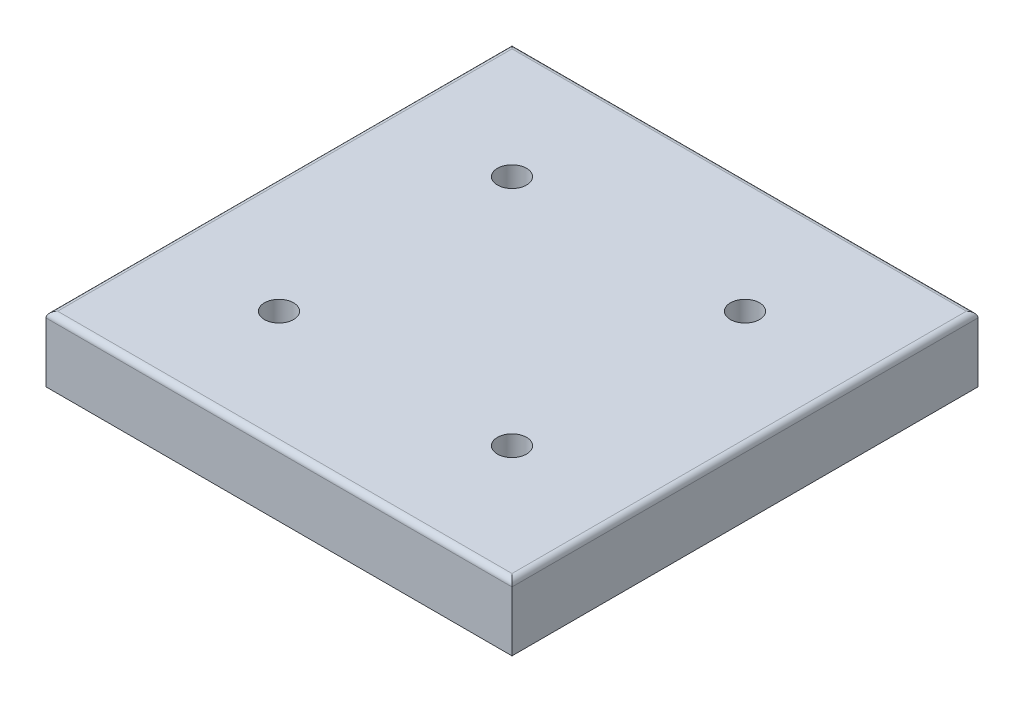
ISO-10303-21;
HEADER;
FILE_DESCRIPTION(('STEP AP214'),'2;1');
FILE_NAME('part.step','',(''),(''),'','','');
FILE_SCHEMA(('AUTOMOTIVE_DESIGN { 1 0 10303 214 1 1 1 1 }'));
ENDSEC;
DATA;
#1=APPLICATION_CONTEXT('core data for automotive mechanical design processes');
#2=APPLICATION_PROTOCOL_DEFINITION('international standard','automotive_design',2000,#1);
#3=PRODUCT_CONTEXT('',#1,'mechanical');
#4=PRODUCT('Part','Part','',(#3));
#5=PRODUCT_RELATED_PRODUCT_CATEGORY('part','',(#4));
#6=PRODUCT_DEFINITION_FORMATION('','',#4);
#7=PRODUCT_DEFINITION_CONTEXT('part definition',#1,'design');
#8=PRODUCT_DEFINITION('design','',#6,#7);
#9=PRODUCT_DEFINITION_SHAPE('','',#8);
#10=(LENGTH_UNIT() NAMED_UNIT(*) SI_UNIT(.MILLI.,.METRE.));
#11=(NAMED_UNIT(*) PLANE_ANGLE_UNIT() SI_UNIT($,.RADIAN.));
#12=(NAMED_UNIT(*) SI_UNIT($,.STERADIAN.) SOLID_ANGLE_UNIT());
#13=UNCERTAINTY_MEASURE_WITH_UNIT(LENGTH_MEASURE(1.E-05),#10,'distance_accuracy_value','');
#14=(GEOMETRIC_REPRESENTATION_CONTEXT(3) GLOBAL_UNCERTAINTY_ASSIGNED_CONTEXT((#13)) GLOBAL_UNIT_ASSIGNED_CONTEXT((#10,
#11,#12)) REPRESENTATION_CONTEXT('',''));
#15=CARTESIAN_POINT('',(0.,0.,0.));
#16=DIRECTION('',(0.,0.,1.));
#17=DIRECTION('',(1.,0.,0.));
#18=AXIS2_PLACEMENT_3D('',#15,#16,#17);
#19=CARTESIAN_POINT('',(0.,22.5,0.));
#20=DIRECTION('',(1.,0.,0.));
#21=DIRECTION('',(0.,0.,-1.));
#22=AXIS2_PLACEMENT_3D('',#19,#20,#21);
#23=PLANE('',#22);
#24=DIRECTION('',(0.,-1.,0.));
#25=VECTOR('',#24,1.);
#26=CARTESIAN_POINT('',(0.,22.5,0.));
#27=LINE('',#26,#25);
#28=CARTESIAN_POINT('',(0.,20.5,0.));
#29=VERTEX_POINT('',#28);
#30=CARTESIAN_POINT('',(0.,0.,0.));
#31=VERTEX_POINT('',#30);
#32=EDGE_CURVE('E87',#29,#31,#27,.T.);
#33=ORIENTED_EDGE('',*,*,#32,.F.);
#34=DIRECTION('',(0.,0.,1.));
#35=VECTOR('',#34,1.);
#36=CARTESIAN_POINT('',(0.,20.5,0.));
#37=LINE('',#36,#35);
#38=CARTESIAN_POINT('',(0.,20.5,-160.));
#39=VERTEX_POINT('',#38);
#40=EDGE_CURVE('E146',#29,#39,#37,.F.);
#41=ORIENTED_EDGE('',*,*,#40,.T.);
#42=DIRECTION('',(0.,-1.,0.));
#43=VECTOR('',#42,1.);
#44=CARTESIAN_POINT('',(0.,22.5,-160.));
#45=LINE('',#44,#43);
#46=CARTESIAN_POINT('',(0.,0.,-160.));
#47=VERTEX_POINT('',#46);
#48=EDGE_CURVE('E110',#39,#47,#45,.T.);
#49=ORIENTED_EDGE('',*,*,#48,.T.);
#50=DIRECTION('',(0.,0.,1.));
#51=VECTOR('',#50,1.);
#52=CARTESIAN_POINT('',(0.,0.,0.));
#53=LINE('',#52,#51);
#54=EDGE_CURVE('E106',#47,#31,#53,.T.);
#55=ORIENTED_EDGE('',*,*,#54,.T.);
#56=EDGE_LOOP('',(#33,#41,#49,#55));
#57=FACE_BOUND('',#56,.T.);
#58=ADVANCED_FACE('F34',(#57),#23,.F.);
#59=CARTESIAN_POINT('',(0.,22.5,0.));
#60=DIRECTION('',(0.,0.,-1.));
#61=DIRECTION('',(-1.,0.,0.));
#62=AXIS2_PLACEMENT_3D('',#59,#60,#61);
#63=PLANE('',#62);
#64=DIRECTION('',(0.,-1.,0.));
#65=VECTOR('',#64,1.);
#66=CARTESIAN_POINT('',(160.,22.5,0.));
#67=LINE('',#66,#65);
#68=CARTESIAN_POINT('',(160.,20.5,0.));
#69=VERTEX_POINT('',#68);
#70=CARTESIAN_POINT('',(160.,0.,0.));
#71=VERTEX_POINT('',#70);
#72=EDGE_CURVE('E99',#69,#71,#67,.T.);
#73=ORIENTED_EDGE('',*,*,#72,.F.);
#74=DIRECTION('',(1.,0.,0.));
#75=VECTOR('',#74,1.);
#76=CARTESIAN_POINT('',(0.,20.5,0.));
#77=LINE('',#76,#75);
#78=EDGE_CURVE('E93',#69,#29,#77,.F.);
#79=ORIENTED_EDGE('',*,*,#78,.T.);
#80=ORIENTED_EDGE('',*,*,#32,.T.);
#81=DIRECTION('',(1.,0.,0.));
#82=VECTOR('',#81,1.);
#83=CARTESIAN_POINT('',(0.,0.,0.));
#84=LINE('',#83,#82);
#85=EDGE_CURVE('E90',#31,#71,#84,.T.);
#86=ORIENTED_EDGE('',*,*,#85,.T.);
#87=EDGE_LOOP('',(#73,#79,#80,#86));
#88=FACE_BOUND('',#87,.T.);
#89=ADVANCED_FACE('F89',(#88),#63,.F.);
#90=CARTESIAN_POINT('',(160.,22.5,0.));
#91=DIRECTION('',(-1.,0.,0.));
#92=DIRECTION('',(0.,0.,1.));
#93=AXIS2_PLACEMENT_3D('',#90,#91,#92);
#94=PLANE('',#93);
#95=DIRECTION('',(0.,-1.,0.));
#96=VECTOR('',#95,1.);
#97=CARTESIAN_POINT('',(160.,22.5,-160.));
#98=LINE('',#97,#96);
#99=CARTESIAN_POINT('',(160.,20.5,-160.));
#100=VERTEX_POINT('',#99);
#101=CARTESIAN_POINT('',(160.,0.,-160.));
#102=VERTEX_POINT('',#101);
#103=EDGE_CURVE('E123',#100,#102,#98,.T.);
#104=ORIENTED_EDGE('',*,*,#103,.F.);
#105=DIRECTION('',(0.,0.,-1.));
#106=VECTOR('',#105,1.);
#107=CARTESIAN_POINT('',(160.,20.5,0.));
#108=LINE('',#107,#106);
#109=EDGE_CURVE('E43',#100,#69,#108,.F.);
#110=ORIENTED_EDGE('',*,*,#109,.T.);
#111=ORIENTED_EDGE('',*,*,#72,.T.);
#112=DIRECTION('',(0.,0.,-1.));
#113=VECTOR('',#112,1.);
#114=CARTESIAN_POINT('',(160.,0.,0.));
#115=LINE('',#114,#113);
#116=EDGE_CURVE('E108',#71,#102,#115,.T.);
#117=ORIENTED_EDGE('',*,*,#116,.T.);
#118=EDGE_LOOP('',(#104,#110,#111,#117));
#119=FACE_BOUND('',#118,.T.);
#120=ADVANCED_FACE('F208',(#119),#94,.F.);
#121=CARTESIAN_POINT('',(0.,22.5,-160.));
#122=DIRECTION('',(0.,0.,1.));
#123=DIRECTION('',(1.,0.,0.));
#124=AXIS2_PLACEMENT_3D('',#121,#122,#123);
#125=PLANE('',#124);
#126=ORIENTED_EDGE('',*,*,#48,.F.);
#127=DIRECTION('',(-1.,0.,0.));
#128=VECTOR('',#127,1.);
#129=CARTESIAN_POINT('',(0.,20.5,-160.));
#130=LINE('',#129,#128);
#131=EDGE_CURVE('E11',#39,#100,#130,.F.);
#132=ORIENTED_EDGE('',*,*,#131,.T.);
#133=ORIENTED_EDGE('',*,*,#103,.T.);
#134=DIRECTION('',(-1.,0.,0.));
#135=VECTOR('',#134,1.);
#136=CARTESIAN_POINT('',(0.,0.,-160.));
#137=LINE('',#136,#135);
#138=EDGE_CURVE('E120',#102,#47,#137,.T.);
#139=ORIENTED_EDGE('',*,*,#138,.T.);
#140=EDGE_LOOP('',(#126,#132,#133,#139));
#141=FACE_BOUND('',#140,.T.);
#142=ADVANCED_FACE('F180',(#141),#125,.F.);
#143=CARTESIAN_POINT('',(0.,22.5,0.));
#144=DIRECTION('',(0.,-1.,0.));
#145=DIRECTION('',(0.,0.,-1.));
#146=AXIS2_PLACEMENT_3D('',#143,#144,#145);
#147=PLANE('',#146);
#148=DIRECTION('',(-1.,0.,0.));
#149=VECTOR('',#148,1.);
#150=CARTESIAN_POINT('',(0.,22.5,-158.));
#151=LINE('',#150,#149);
#152=CARTESIAN_POINT('',(158.,22.5,-158.));
#153=VERTEX_POINT('',#152);
#154=CARTESIAN_POINT('',(2.,22.5,-158.));
#155=VERTEX_POINT('',#154);
#156=EDGE_CURVE('E137',#153,#155,#151,.T.);
#157=ORIENTED_EDGE('',*,*,#156,.T.);
#158=DIRECTION('',(0.,0.,1.));
#159=VECTOR('',#158,1.);
#160=CARTESIAN_POINT('',(2.,22.5,0.));
#161=LINE('',#160,#159);
#162=CARTESIAN_POINT('',(2.,22.5,-2.));
#163=VERTEX_POINT('',#162);
#164=EDGE_CURVE('E143',#155,#163,#161,.T.);
#165=ORIENTED_EDGE('',*,*,#164,.T.);
#166=DIRECTION('',(1.,0.,0.));
#167=VECTOR('',#166,1.);
#168=CARTESIAN_POINT('',(0.,22.5,-2.));
#169=LINE('',#168,#167);
#170=CARTESIAN_POINT('',(158.,22.5,-2.));
#171=VERTEX_POINT('',#170);
#172=EDGE_CURVE('E141',#163,#171,#169,.T.);
#173=ORIENTED_EDGE('',*,*,#172,.T.);
#174=DIRECTION('',(0.,0.,-1.));
#175=VECTOR('',#174,1.);
#176=CARTESIAN_POINT('',(158.,22.5,0.));
#177=LINE('',#176,#175);
#178=EDGE_CURVE('E139',#171,#153,#177,.T.);
#179=ORIENTED_EDGE('',*,*,#178,.T.);
#180=EDGE_LOOP('',(#157,#165,#173,#179));
#181=FACE_BOUND('',#180,.T.);
#182=CARTESIAN_POINT('',(120.,22.5,-120.));
#183=DIRECTION('',(0.,1.,0.));
#184=DIRECTION('',(0.,0.,1.));
#185=AXIS2_PLACEMENT_3D('',#182,#183,#184);
#186=CIRCLE('',#185,5.);
#187=CARTESIAN_POINT('',(120.,22.5,-115.));
#188=VERTEX_POINT('',#187);
#189=EDGE_CURVE('E164',#188,#188,#186,.T.);
#190=ORIENTED_EDGE('',*,*,#189,.F.);
#191=EDGE_LOOP('',(#190));
#192=FACE_BOUND('',#191,.T.);
#193=CARTESIAN_POINT('',(40.,22.5,-120.));
#194=DIRECTION('',(0.,1.,0.));
#195=DIRECTION('',(0.,0.,1.));
#196=AXIS2_PLACEMENT_3D('',#193,#194,#195);
#197=CIRCLE('',#196,5.);
#198=CARTESIAN_POINT('',(40.,22.5,-115.));
#199=VERTEX_POINT('',#198);
#200=EDGE_CURVE('E115',#199,#199,#197,.T.);
#201=ORIENTED_EDGE('',*,*,#200,.F.);
#202=EDGE_LOOP('',(#201));
#203=FACE_BOUND('',#202,.T.);
#204=CARTESIAN_POINT('',(40.,22.5,-40.));
#205=DIRECTION('',(0.,1.,0.));
#206=DIRECTION('',(0.,0.,1.));
#207=AXIS2_PLACEMENT_3D('',#204,#205,#206);
#208=CIRCLE('',#207,5.);
#209=CARTESIAN_POINT('',(40.,22.5,-35.));
#210=VERTEX_POINT('',#209);
#211=EDGE_CURVE('E128',#210,#210,#208,.T.);
#212=ORIENTED_EDGE('',*,*,#211,.F.);
#213=EDGE_LOOP('',(#212));
#214=FACE_BOUND('',#213,.T.);
#215=CARTESIAN_POINT('',(120.,22.5,-40.));
#216=DIRECTION('',(0.,1.,0.));
#217=DIRECTION('',(0.,0.,1.));
#218=AXIS2_PLACEMENT_3D('',#215,#216,#217);
#219=CIRCLE('',#218,5.);
#220=CARTESIAN_POINT('',(120.,22.5,-35.));
#221=VERTEX_POINT('',#220);
#222=EDGE_CURVE('E134',#221,#221,#219,.T.);
#223=ORIENTED_EDGE('',*,*,#222,.F.);
#224=EDGE_LOOP('',(#223));
#225=FACE_BOUND('',#224,.T.);
#226=ADVANCED_FACE('F177',(#181,#192,#203,#214,#225),#147,.F.);
#227=CARTESIAN_POINT('',(0.,0.,0.));
#228=DIRECTION('',(0.,-1.,0.));
#229=DIRECTION('',(0.,0.,-1.));
#230=AXIS2_PLACEMENT_3D('',#227,#228,#229);
#231=PLANE('',#230);
#232=CARTESIAN_POINT('',(120.,0.,-120.));
#233=DIRECTION('',(0.,1.,0.));
#234=DIRECTION('',(0.,0.,1.));
#235=AXIS2_PLACEMENT_3D('',#232,#233,#234);
#236=CIRCLE('',#235,5.);
#237=CARTESIAN_POINT('',(120.,0.,-115.));
#238=VERTEX_POINT('',#237);
#239=EDGE_CURVE('E159',#238,#238,#236,.T.);
#240=ORIENTED_EDGE('',*,*,#239,.T.);
#241=EDGE_LOOP('',(#240));
#242=FACE_BOUND('',#241,.T.);
#243=CARTESIAN_POINT('',(40.,0.,-120.));
#244=DIRECTION('',(0.,1.,0.));
#245=DIRECTION('',(0.,0.,1.));
#246=AXIS2_PLACEMENT_3D('',#243,#244,#245);
#247=CIRCLE('',#246,5.);
#248=CARTESIAN_POINT('',(40.,0.,-115.));
#249=VERTEX_POINT('',#248);
#250=EDGE_CURVE('E112',#249,#249,#247,.T.);
#251=ORIENTED_EDGE('',*,*,#250,.T.);
#252=EDGE_LOOP('',(#251));
#253=FACE_BOUND('',#252,.T.);
#254=ORIENTED_EDGE('',*,*,#54,.F.);
#255=ORIENTED_EDGE('',*,*,#138,.F.);
#256=ORIENTED_EDGE('',*,*,#116,.F.);
#257=ORIENTED_EDGE('',*,*,#85,.F.);
#258=EDGE_LOOP('',(#254,#255,#256,#257));
#259=FACE_BOUND('',#258,.T.);
#260=CARTESIAN_POINT('',(40.,0.,-40.));
#261=DIRECTION('',(0.,1.,0.));
#262=DIRECTION('',(0.,0.,1.));
#263=AXIS2_PLACEMENT_3D('',#260,#261,#262);
#264=CIRCLE('',#263,5.);
#265=CARTESIAN_POINT('',(40.,0.,-35.));
#266=VERTEX_POINT('',#265);
#267=EDGE_CURVE('E98',#266,#266,#264,.T.);
#268=ORIENTED_EDGE('',*,*,#267,.T.);
#269=EDGE_LOOP('',(#268));
#270=FACE_BOUND('',#269,.T.);
#271=CARTESIAN_POINT('',(120.,0.,-40.));
#272=DIRECTION('',(0.,1.,0.));
#273=DIRECTION('',(0.,0.,1.));
#274=AXIS2_PLACEMENT_3D('',#271,#272,#273);
#275=CIRCLE('',#274,5.);
#276=CARTESIAN_POINT('',(120.,0.,-35.));
#277=VERTEX_POINT('',#276);
#278=EDGE_CURVE('E131',#277,#277,#275,.T.);
#279=ORIENTED_EDGE('',*,*,#278,.T.);
#280=EDGE_LOOP('',(#279));
#281=FACE_BOUND('',#280,.T.);
#282=ADVANCED_FACE('F103',(#242,#253,#259,#270,#281),#231,.T.);
#283=CARTESIAN_POINT('',(40.,0.,-120.));
#284=DIRECTION('',(0.,1.,0.));
#285=DIRECTION('',(0.,0.,1.));
#286=AXIS2_PLACEMENT_3D('',#283,#284,#285);
#287=CYLINDRICAL_SURFACE('',#286,5.);
#288=ORIENTED_EDGE('',*,*,#250,.F.);
#289=EDGE_LOOP('',(#288));
#290=FACE_BOUND('',#289,.T.);
#291=ORIENTED_EDGE('',*,*,#200,.T.);
#292=EDGE_LOOP('',(#291));
#293=FACE_BOUND('',#292,.T.);
#294=ADVANCED_FACE('F175',(#290,#293),#287,.F.);
#295=CARTESIAN_POINT('',(120.,0.,-120.));
#296=DIRECTION('',(0.,1.,0.));
#297=DIRECTION('',(0.,0.,1.));
#298=AXIS2_PLACEMENT_3D('',#295,#296,#297);
#299=CYLINDRICAL_SURFACE('',#298,5.);
#300=ORIENTED_EDGE('',*,*,#239,.F.);
#301=EDGE_LOOP('',(#300));
#302=FACE_BOUND('',#301,.T.);
#303=ORIENTED_EDGE('',*,*,#189,.T.);
#304=EDGE_LOOP('',(#303));
#305=FACE_BOUND('',#304,.T.);
#306=ADVANCED_FACE('F198',(#302,#305),#299,.F.);
#307=CARTESIAN_POINT('',(40.,0.,-40.));
#308=DIRECTION('',(0.,1.,0.));
#309=DIRECTION('',(0.,0.,1.));
#310=AXIS2_PLACEMENT_3D('',#307,#308,#309);
#311=CYLINDRICAL_SURFACE('',#310,5.);
#312=ORIENTED_EDGE('',*,*,#267,.F.);
#313=EDGE_LOOP('',(#312));
#314=FACE_BOUND('',#313,.T.);
#315=ORIENTED_EDGE('',*,*,#211,.T.);
#316=EDGE_LOOP('',(#315));
#317=FACE_BOUND('',#316,.T.);
#318=ADVANCED_FACE('F189',(#314,#317),#311,.F.);
#319=CARTESIAN_POINT('',(120.,0.,-40.));
#320=DIRECTION('',(0.,1.,0.));
#321=DIRECTION('',(0.,0.,1.));
#322=AXIS2_PLACEMENT_3D('',#319,#320,#321);
#323=CYLINDRICAL_SURFACE('',#322,5.);
#324=ORIENTED_EDGE('',*,*,#278,.F.);
#325=EDGE_LOOP('',(#324));
#326=FACE_BOUND('',#325,.T.);
#327=ORIENTED_EDGE('',*,*,#222,.T.);
#328=EDGE_LOOP('',(#327));
#329=FACE_BOUND('',#328,.T.);
#330=ADVANCED_FACE('F187',(#326,#329),#323,.F.);
#331=CARTESIAN_POINT('',(158.,20.5,0.));
#332=DIRECTION('',(0.,0.,-1.));
#333=DIRECTION('',(-1.,0.,0.));
#334=AXIS2_PLACEMENT_3D('',#331,#332,#333);
#335=CYLINDRICAL_SURFACE('',#334,2.);
#336=CARTESIAN_POINT('',(158.,20.5,-2.));
#337=DIRECTION('',(0.707106781186547,0.,-0.707106781186547));
#338=DIRECTION('',(-0.707106781186547,0.,-0.707106781186547));
#339=AXIS2_PLACEMENT_3D('',#336,#337,#338);
#340=ELLIPSE('',#339,2.82842712474619,2.);
#341=EDGE_CURVE('E153',#69,#171,#340,.F.);
#342=ORIENTED_EDGE('',*,*,#341,.F.);
#343=ORIENTED_EDGE('',*,*,#109,.F.);
#344=CARTESIAN_POINT('',(158.,20.5,-158.));
#345=DIRECTION('',(-0.707106781186547,0.,-0.707106781186547));
#346=DIRECTION('',(-0.707106781186547,0.,0.707106781186547));
#347=AXIS2_PLACEMENT_3D('',#344,#345,#346);
#348=ELLIPSE('',#347,2.82842712474619,2.);
#349=EDGE_CURVE('E38',#153,#100,#348,.T.);
#350=ORIENTED_EDGE('',*,*,#349,.F.);
#351=ORIENTED_EDGE('',*,*,#178,.F.);
#352=EDGE_LOOP('',(#342,#343,#350,#351));
#353=FACE_BOUND('',#352,.T.);
#354=ADVANCED_FACE('F36',(#353),#335,.T.);
#355=CARTESIAN_POINT('',(0.,20.5,-158.));
#356=DIRECTION('',(-1.,0.,0.));
#357=DIRECTION('',(0.,0.,1.));
#358=AXIS2_PLACEMENT_3D('',#355,#356,#357);
#359=CYLINDRICAL_SURFACE('',#358,2.);
#360=ORIENTED_EDGE('',*,*,#349,.T.);
#361=ORIENTED_EDGE('',*,*,#131,.F.);
#362=CARTESIAN_POINT('',(2.,20.5,-158.));
#363=DIRECTION('',(-0.707106781186547,0.,0.707106781186547));
#364=DIRECTION('',(-0.707106781186547,0.,-0.707106781186547));
#365=AXIS2_PLACEMENT_3D('',#362,#363,#364);
#366=ELLIPSE('',#365,2.82842712474619,2.);
#367=EDGE_CURVE('E152',#155,#39,#366,.T.);
#368=ORIENTED_EDGE('',*,*,#367,.F.);
#369=ORIENTED_EDGE('',*,*,#156,.F.);
#370=EDGE_LOOP('',(#360,#361,#368,#369));
#371=FACE_BOUND('',#370,.T.);
#372=ADVANCED_FACE('F196',(#371),#359,.T.);
#373=CARTESIAN_POINT('',(0.,20.5,-2.));
#374=DIRECTION('',(1.,0.,0.));
#375=DIRECTION('',(0.,0.,-1.));
#376=AXIS2_PLACEMENT_3D('',#373,#374,#375);
#377=CYLINDRICAL_SURFACE('',#376,2.);
#378=ORIENTED_EDGE('',*,*,#341,.T.);
#379=ORIENTED_EDGE('',*,*,#172,.F.);
#380=CARTESIAN_POINT('',(2.,20.5,-2.));
#381=DIRECTION('',(0.707106781186547,0.,0.707106781186547));
#382=DIRECTION('',(0.707106781186547,0.,-0.707106781186547));
#383=AXIS2_PLACEMENT_3D('',#380,#381,#382);
#384=ELLIPSE('',#383,2.82842712474619,2.);
#385=EDGE_CURVE('E150',#29,#163,#384,.F.);
#386=ORIENTED_EDGE('',*,*,#385,.F.);
#387=ORIENTED_EDGE('',*,*,#78,.F.);
#388=EDGE_LOOP('',(#378,#379,#386,#387));
#389=FACE_BOUND('',#388,.T.);
#390=ADVANCED_FACE('F279',(#389),#377,.T.);
#391=CARTESIAN_POINT('',(2.,20.5,0.));
#392=DIRECTION('',(0.,0.,1.));
#393=DIRECTION('',(1.,0.,0.));
#394=AXIS2_PLACEMENT_3D('',#391,#392,#393);
#395=CYLINDRICAL_SURFACE('',#394,2.);
#396=ORIENTED_EDGE('',*,*,#367,.T.);
#397=ORIENTED_EDGE('',*,*,#40,.F.);
#398=ORIENTED_EDGE('',*,*,#385,.T.);
#399=ORIENTED_EDGE('',*,*,#164,.F.);
#400=EDGE_LOOP('',(#396,#397,#398,#399));
#401=FACE_BOUND('',#400,.T.);
#402=ADVANCED_FACE('F287',(#401),#395,.T.);
#403=CLOSED_SHELL('',(#58,#89,#120,#142,#226,#282,#294,#306,#318,#330,#354,#372,#390,#402));
#404=MANIFOLD_SOLID_BREP('B2',#403);
#405=ADVANCED_BREP_SHAPE_REPRESENTATION('',(#18,#404),#14);
#406=SHAPE_DEFINITION_REPRESENTATION(#9,#405);
ENDSEC;
END-ISO-10303-21;
